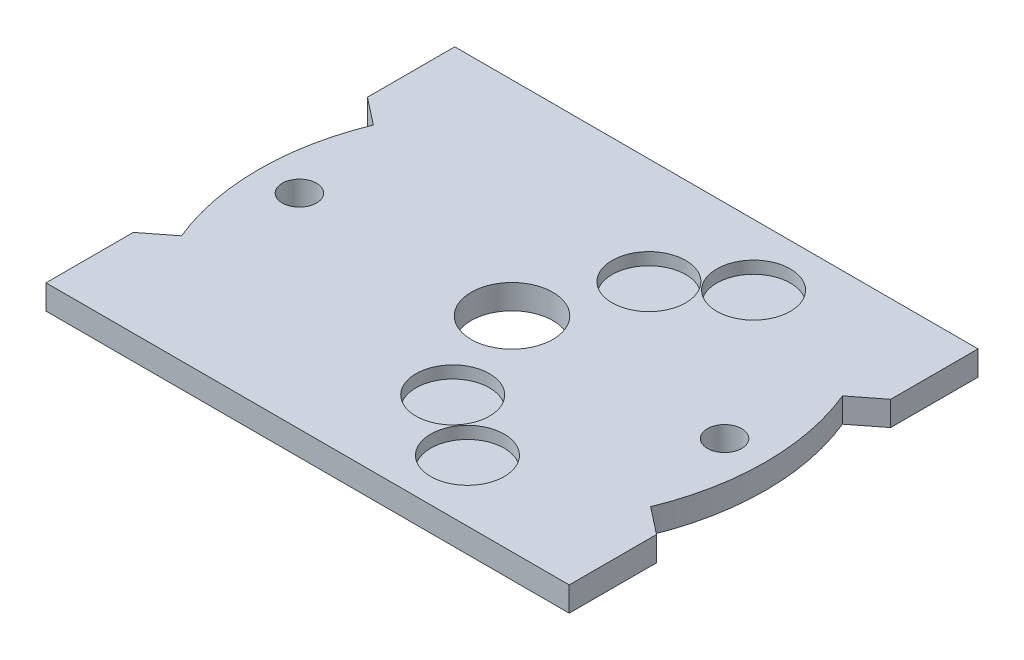
ISO-10303-21;
HEADER;
FILE_DESCRIPTION(('STEP AP214'),'2;1');
FILE_NAME('part.step','',(''),(''),'','','');
FILE_SCHEMA(('AUTOMOTIVE_DESIGN { 1 0 10303 214 1 1 1 1 }'));
ENDSEC;
DATA;
#1=APPLICATION_CONTEXT('core data for automotive mechanical design processes');
#2=APPLICATION_PROTOCOL_DEFINITION('international standard','automotive_design',2000,#1);
#3=PRODUCT_CONTEXT('',#1,'mechanical');
#4=PRODUCT('Part','Part','',(#3));
#5=PRODUCT_RELATED_PRODUCT_CATEGORY('part','',(#4));
#6=PRODUCT_DEFINITION_FORMATION('','',#4);
#7=PRODUCT_DEFINITION_CONTEXT('part definition',#1,'design');
#8=PRODUCT_DEFINITION('design','',#6,#7);
#9=PRODUCT_DEFINITION_SHAPE('','',#8);
#10=(LENGTH_UNIT() NAMED_UNIT(*) SI_UNIT(.MILLI.,.METRE.));
#11=(NAMED_UNIT(*) PLANE_ANGLE_UNIT() SI_UNIT($,.RADIAN.));
#12=(NAMED_UNIT(*) SI_UNIT($,.STERADIAN.) SOLID_ANGLE_UNIT());
#13=UNCERTAINTY_MEASURE_WITH_UNIT(LENGTH_MEASURE(1.E-05),#10,'distance_accuracy_value','');
#14=(GEOMETRIC_REPRESENTATION_CONTEXT(3) GLOBAL_UNCERTAINTY_ASSIGNED_CONTEXT((#13)) GLOBAL_UNIT_ASSIGNED_CONTEXT((#10,
#11,#12)) REPRESENTATION_CONTEXT('',''));
#15=CARTESIAN_POINT('',(0.,0.,0.));
#16=DIRECTION('',(0.,0.,1.));
#17=DIRECTION('',(1.,0.,0.));
#18=AXIS2_PLACEMENT_3D('',#15,#16,#17);
#19=CARTESIAN_POINT('',(0.,3.,0.));
#20=DIRECTION('',(0.,1.,0.));
#21=DIRECTION('',(0.,0.,1.));
#22=AXIS2_PLACEMENT_3D('',#19,#20,#21);
#23=PLANE('',#22);
#24=CARTESIAN_POINT('',(4.75,3.,-12.));
#25=DIRECTION('',(0.,1.,0.));
#26=DIRECTION('',(0.,0.,1.));
#27=AXIS2_PLACEMENT_3D('',#24,#25,#26);
#28=CIRCLE('',#27,4.5);
#29=CARTESIAN_POINT('',(4.75,3.,-7.49999999999999));
#30=VERTEX_POINT('',#29);
#31=EDGE_CURVE('E358',#30,#30,#28,.T.);
#32=ORIENTED_EDGE('',*,*,#31,.F.);
#33=EDGE_LOOP('',(#32));
#34=FACE_BOUND('',#33,.T.);
#35=CARTESIAN_POINT('',(12.05,3.,17.5));
#36=DIRECTION('',(0.,-1.,0.));
#37=DIRECTION('',(0.,0.,-1.));
#38=AXIS2_PLACEMENT_3D('',#35,#36,#37);
#39=CIRCLE('',#38,4.5);
#40=CARTESIAN_POINT('',(12.05,3.,13.));
#41=VERTEX_POINT('',#40);
#42=EDGE_CURVE('E361',#41,#41,#39,.T.);
#43=ORIENTED_EDGE('',*,*,#42,.T.);
#44=EDGE_LOOP('',(#43));
#45=FACE_BOUND('',#44,.T.);
#46=CARTESIAN_POINT('',(12.05,3.,-17.5));
#47=DIRECTION('',(0.,1.,0.));
#48=DIRECTION('',(0.,0.,1.));
#49=AXIS2_PLACEMENT_3D('',#46,#47,#48);
#50=CIRCLE('',#49,4.5);
#51=CARTESIAN_POINT('',(12.05,3.,-13.));
#52=VERTEX_POINT('',#51);
#53=EDGE_CURVE('E369',#52,#52,#50,.T.);
#54=ORIENTED_EDGE('',*,*,#53,.F.);
#55=EDGE_LOOP('',(#54));
#56=FACE_BOUND('',#55,.T.);
#57=CARTESIAN_POINT('',(0.,3.,0.));
#58=DIRECTION('',(0.,1.,0.));
#59=DIRECTION('',(0.,0.,1.));
#60=AXIS2_PLACEMENT_3D('',#57,#58,#59);
#61=CIRCLE('',#60,5.);
#62=CARTESIAN_POINT('',(0.,3.,5.));
#63=VERTEX_POINT('',#62);
#64=EDGE_CURVE('E92',#63,#63,#61,.F.);
#65=ORIENTED_EDGE('',*,*,#64,.T.);
#66=EDGE_LOOP('',(#65));
#67=FACE_BOUND('',#66,.T.);
#68=DIRECTION('',(-1.,0.,0.));
#69=VECTOR('',#68,1.);
#70=CARTESIAN_POINT('',(0.,3.,25.));
#71=LINE('',#70,#69);
#72=CARTESIAN_POINT('',(32.,3.,25.));
#73=VERTEX_POINT('',#72);
#74=CARTESIAN_POINT('',(-32.,3.,25.));
#75=VERTEX_POINT('',#74);
#76=EDGE_CURVE('E249',#73,#75,#71,.T.);
#77=ORIENTED_EDGE('',*,*,#76,.F.);
#78=DIRECTION('',(0.,0.,-1.));
#79=VECTOR('',#78,1.);
#80=CARTESIAN_POINT('',(32.,3.,0.));
#81=LINE('',#80,#79);
#82=CARTESIAN_POINT('',(32.,3.,14.320549046737));
#83=VERTEX_POINT('',#82);
#84=EDGE_CURVE('E375',#73,#83,#81,.T.);
#85=ORIENTED_EDGE('',*,*,#84,.T.);
#86=DIRECTION('',(0.788024373724563,0.,0.615644041972315));
#87=VECTOR('',#86,1.);
#88=CARTESIAN_POINT('',(5.18105564742899,3.,-6.63175122870911));
#89=LINE('',#88,#87);
#90=CARTESIAN_POINT('',(28.6924140746813,3.,11.7364975425818));
#91=VERTEX_POINT('',#90);
#92=EDGE_CURVE('E274',#91,#83,#89,.T.);
#93=ORIENTED_EDGE('',*,*,#92,.F.);
#94=CARTESIAN_POINT('',(0.,3.,0.));
#95=DIRECTION('',(0.,1.,0.));
#96=DIRECTION('',(0.,0.,1.));
#97=AXIS2_PLACEMENT_3D('',#94,#95,#96);
#98=CIRCLE('',#97,31.);
#99=CARTESIAN_POINT('',(28.6924140746813,3.,-11.7364975425818));
#100=VERTEX_POINT('',#99);
#101=EDGE_CURVE('E295',#91,#100,#98,.T.);
#102=ORIENTED_EDGE('',*,*,#101,.T.);
#103=DIRECTION('',(0.788024373724563,0.,-0.615644041972316));
#104=VECTOR('',#103,1.);
#105=CARTESIAN_POINT('',(5.18105564742899,3.,6.6317512287091));
#106=LINE('',#105,#104);
#107=CARTESIAN_POINT('',(32.,3.,-14.320549046737));
#108=VERTEX_POINT('',#107);
#109=EDGE_CURVE('E292',#100,#108,#106,.T.);
#110=ORIENTED_EDGE('',*,*,#109,.T.);
#111=DIRECTION('',(0.,0.,-1.));
#112=VECTOR('',#111,1.);
#113=CARTESIAN_POINT('',(32.,3.,0.));
#114=LINE('',#113,#112);
#115=CARTESIAN_POINT('',(32.,3.,-25.));
#116=VERTEX_POINT('',#115);
#117=EDGE_CURVE('E294',#108,#116,#114,.T.);
#118=ORIENTED_EDGE('',*,*,#117,.T.);
#119=DIRECTION('',(-1.,0.,0.));
#120=VECTOR('',#119,1.);
#121=CARTESIAN_POINT('',(0.,3.,-25.));
#122=LINE('',#121,#120);
#123=CARTESIAN_POINT('',(-32.,3.,-25.));
#124=VERTEX_POINT('',#123);
#125=EDGE_CURVE('E297',#116,#124,#122,.T.);
#126=ORIENTED_EDGE('',*,*,#125,.T.);
#127=DIRECTION('',(0.,0.,-1.));
#128=VECTOR('',#127,1.);
#129=CARTESIAN_POINT('',(-32.,3.,0.));
#130=LINE('',#129,#128);
#131=CARTESIAN_POINT('',(-32.,3.,-14.320549046737));
#132=VERTEX_POINT('',#131);
#133=EDGE_CURVE('E303',#132,#124,#130,.T.);
#134=ORIENTED_EDGE('',*,*,#133,.F.);
#135=DIRECTION('',(-0.788024373724563,0.,-0.615644041972316));
#136=VECTOR('',#135,1.);
#137=CARTESIAN_POINT('',(-5.181055647429,3.,6.63175122870911));
#138=LINE('',#137,#136);
#139=CARTESIAN_POINT('',(-28.6924140746813,3.,-11.7364975425818));
#140=VERTEX_POINT('',#139);
#141=EDGE_CURVE('E190',#140,#132,#138,.T.);
#142=ORIENTED_EDGE('',*,*,#141,.F.);
#143=CARTESIAN_POINT('',(0.,3.,0.));
#144=DIRECTION('',(0.,1.,0.));
#145=DIRECTION('',(0.,0.,1.));
#146=AXIS2_PLACEMENT_3D('',#143,#144,#145);
#147=CIRCLE('',#146,31.);
#148=CARTESIAN_POINT('',(-28.6924140746813,3.,11.7364975425818));
#149=VERTEX_POINT('',#148);
#150=EDGE_CURVE('E181',#140,#149,#147,.T.);
#151=ORIENTED_EDGE('',*,*,#150,.T.);
#152=DIRECTION('',(-0.788024373724563,0.,0.615644041972316));
#153=VECTOR('',#152,1.);
#154=CARTESIAN_POINT('',(-5.181055647429,3.,-6.63175122870911));
#155=LINE('',#154,#153);
#156=CARTESIAN_POINT('',(-32.,3.,14.320549046737));
#157=VERTEX_POINT('',#156);
#158=EDGE_CURVE('E187',#149,#157,#155,.T.);
#159=ORIENTED_EDGE('',*,*,#158,.T.);
#160=DIRECTION('',(0.,0.,-1.));
#161=VECTOR('',#160,1.);
#162=CARTESIAN_POINT('',(-32.,3.,0.));
#163=LINE('',#162,#161);
#164=EDGE_CURVE('E203',#75,#157,#163,.T.);
#165=ORIENTED_EDGE('',*,*,#164,.F.);
#166=EDGE_LOOP('',(#77,#85,#93,#102,#110,#118,#126,#134,#142,#151,#159,#165));
#167=FACE_BOUND('',#166,.T.);
#168=CARTESIAN_POINT('',(-26.,3.,0.));
#169=DIRECTION('',(0.,1.,0.));
#170=DIRECTION('',(0.,0.,1.));
#171=AXIS2_PLACEMENT_3D('',#168,#169,#170);
#172=CIRCLE('',#171,2.1);
#173=CARTESIAN_POINT('',(-26.,3.,2.10000000000001));
#174=VERTEX_POINT('',#173);
#175=EDGE_CURVE('E205',#174,#174,#172,.T.);
#176=ORIENTED_EDGE('',*,*,#175,.F.);
#177=EDGE_LOOP('',(#176));
#178=FACE_BOUND('',#177,.T.);
#179=CARTESIAN_POINT('',(26.,3.,0.));
#180=DIRECTION('',(0.,1.,0.));
#181=DIRECTION('',(0.,0.,1.));
#182=AXIS2_PLACEMENT_3D('',#179,#180,#181);
#183=CIRCLE('',#182,2.1);
#184=CARTESIAN_POINT('',(26.,3.,2.09999999999999));
#185=VERTEX_POINT('',#184);
#186=EDGE_CURVE('E211',#185,#185,#183,.F.);
#187=ORIENTED_EDGE('',*,*,#186,.T.);
#188=EDGE_LOOP('',(#187));
#189=FACE_BOUND('',#188,.T.);
#190=CARTESIAN_POINT('',(4.75,3.,12.));
#191=DIRECTION('',(0.,-1.,0.));
#192=DIRECTION('',(0.,0.,-1.));
#193=AXIS2_PLACEMENT_3D('',#190,#191,#192);
#194=CIRCLE('',#193,4.50000000000001);
#195=CARTESIAN_POINT('',(4.75,3.,7.49999999999998));
#196=VERTEX_POINT('',#195);
#197=EDGE_CURVE('E352',#196,#196,#194,.T.);
#198=ORIENTED_EDGE('',*,*,#197,.T.);
#199=EDGE_LOOP('',(#198));
#200=FACE_BOUND('',#199,.T.);
#201=ADVANCED_FACE('F88',(#34,#45,#56,#67,#167,#178,#189,#200),#23,.T.);
#202=CARTESIAN_POINT('',(26.,3.,0.));
#203=DIRECTION('',(0.,-1.,0.));
#204=DIRECTION('',(0.,0.,-1.));
#205=AXIS2_PLACEMENT_3D('',#202,#203,#204);
#206=CYLINDRICAL_SURFACE('',#205,2.1);
#207=ORIENTED_EDGE('',*,*,#186,.F.);
#208=EDGE_LOOP('',(#207));
#209=FACE_BOUND('',#208,.T.);
#210=CARTESIAN_POINT('',(26.,0.,0.));
#211=DIRECTION('',(0.,1.,0.));
#212=DIRECTION('',(0.,0.,1.));
#213=AXIS2_PLACEMENT_3D('',#210,#211,#212);
#214=CIRCLE('',#213,2.1);
#215=CARTESIAN_POINT('',(26.,0.,2.09999999999999));
#216=VERTEX_POINT('',#215);
#217=EDGE_CURVE('E246',#216,#216,#214,.F.);
#218=ORIENTED_EDGE('',*,*,#217,.T.);
#219=EDGE_LOOP('',(#218));
#220=FACE_BOUND('',#219,.T.);
#221=ADVANCED_FACE('F319',(#209,#220),#206,.F.);
#222=CARTESIAN_POINT('',(-26.,3.,0.));
#223=DIRECTION('',(0.,-1.,0.));
#224=DIRECTION('',(0.,0.,-1.));
#225=AXIS2_PLACEMENT_3D('',#222,#223,#224);
#226=CYLINDRICAL_SURFACE('',#225,2.1);
#227=ORIENTED_EDGE('',*,*,#175,.T.);
#228=EDGE_LOOP('',(#227));
#229=FACE_BOUND('',#228,.T.);
#230=CARTESIAN_POINT('',(-26.,0.,0.));
#231=DIRECTION('',(0.,1.,0.));
#232=DIRECTION('',(0.,0.,1.));
#233=AXIS2_PLACEMENT_3D('',#230,#231,#232);
#234=CIRCLE('',#233,2.1);
#235=CARTESIAN_POINT('',(-26.,0.,2.10000000000001));
#236=VERTEX_POINT('',#235);
#237=EDGE_CURVE('E243',#236,#236,#234,.T.);
#238=ORIENTED_EDGE('',*,*,#237,.F.);
#239=EDGE_LOOP('',(#238));
#240=FACE_BOUND('',#239,.T.);
#241=ADVANCED_FACE('F325',(#229,#240),#226,.F.);
#242=CARTESIAN_POINT('',(32.,3.,0.));
#243=DIRECTION('',(-1.,0.,0.));
#244=DIRECTION('',(0.,0.,1.));
#245=AXIS2_PLACEMENT_3D('',#242,#243,#244);
#246=PLANE('',#245);
#247=DIRECTION('',(0.,0.,-1.));
#248=VECTOR('',#247,1.);
#249=CARTESIAN_POINT('',(32.,0.,0.));
#250=LINE('',#249,#248);
#251=CARTESIAN_POINT('',(32.,0.,25.));
#252=VERTEX_POINT('',#251);
#253=CARTESIAN_POINT('',(32.,0.,14.320549046737));
#254=VERTEX_POINT('',#253);
#255=EDGE_CURVE('E216',#252,#254,#250,.T.);
#256=ORIENTED_EDGE('',*,*,#255,.T.);
#257=DIRECTION('',(0.,-1.,0.));
#258=VECTOR('',#257,1.);
#259=CARTESIAN_POINT('',(32.,3.,14.320549046737));
#260=LINE('',#259,#258);
#261=EDGE_CURVE('E98',#83,#254,#260,.T.);
#262=ORIENTED_EDGE('',*,*,#261,.F.);
#263=ORIENTED_EDGE('',*,*,#84,.F.);
#264=DIRECTION('',(0.,-1.,0.));
#265=VECTOR('',#264,1.);
#266=CARTESIAN_POINT('',(32.,3.,25.));
#267=LINE('',#266,#265);
#268=EDGE_CURVE('E12',#73,#252,#267,.T.);
#269=ORIENTED_EDGE('',*,*,#268,.T.);
#270=EDGE_LOOP('',(#256,#262,#263,#269));
#271=FACE_BOUND('',#270,.T.);
#272=ADVANCED_FACE('F277',(#271),#246,.F.);
#273=CARTESIAN_POINT('',(5.18105564742899,3.,-6.63175122870911));
#274=DIRECTION('',(0.615644041972315,0.,-0.788024373724563));
#275=DIRECTION('',(-0.788024373724563,0.,-0.615644041972315));
#276=AXIS2_PLACEMENT_3D('',#273,#274,#275);
#277=PLANE('',#276);
#278=DIRECTION('',(0.788024373724563,0.,0.615644041972315));
#279=VECTOR('',#278,1.);
#280=CARTESIAN_POINT('',(5.18105564742899,0.,-6.63175122870911));
#281=LINE('',#280,#279);
#282=CARTESIAN_POINT('',(28.6924140746813,0.,11.7364975425818));
#283=VERTEX_POINT('',#282);
#284=EDGE_CURVE('E219',#283,#254,#281,.T.);
#285=ORIENTED_EDGE('',*,*,#284,.F.);
#286=DIRECTION('',(0.,-1.,0.));
#287=VECTOR('',#286,1.);
#288=CARTESIAN_POINT('',(28.6924140746813,3.,11.7364975425818));
#289=LINE('',#288,#287);
#290=EDGE_CURVE('E266',#91,#283,#289,.T.);
#291=ORIENTED_EDGE('',*,*,#290,.F.);
#292=ORIENTED_EDGE('',*,*,#92,.T.);
#293=ORIENTED_EDGE('',*,*,#261,.T.);
#294=EDGE_LOOP('',(#285,#291,#292,#293));
#295=FACE_BOUND('',#294,.T.);
#296=ADVANCED_FACE('F272',(#295),#277,.T.);
#297=CARTESIAN_POINT('',(0.,3.,0.));
#298=DIRECTION('',(0.,-1.,0.));
#299=DIRECTION('',(0.,0.,-1.));
#300=AXIS2_PLACEMENT_3D('',#297,#298,#299);
#301=CYLINDRICAL_SURFACE('',#300,31.);
#302=CARTESIAN_POINT('',(0.,0.,0.));
#303=DIRECTION('',(0.,1.,0.));
#304=DIRECTION('',(0.,0.,1.));
#305=AXIS2_PLACEMENT_3D('',#302,#303,#304);
#306=CIRCLE('',#305,31.);
#307=CARTESIAN_POINT('',(28.6924140746813,0.,-11.7364975425818));
#308=VERTEX_POINT('',#307);
#309=EDGE_CURVE('E222',#283,#308,#306,.T.);
#310=ORIENTED_EDGE('',*,*,#309,.T.);
#311=DIRECTION('',(0.,-1.,0.));
#312=VECTOR('',#311,1.);
#313=CARTESIAN_POINT('',(28.6924140746813,3.,-11.7364975425818));
#314=LINE('',#313,#312);
#315=EDGE_CURVE('E263',#100,#308,#314,.T.);
#316=ORIENTED_EDGE('',*,*,#315,.F.);
#317=ORIENTED_EDGE('',*,*,#101,.F.);
#318=ORIENTED_EDGE('',*,*,#290,.T.);
#319=EDGE_LOOP('',(#310,#316,#317,#318));
#320=FACE_BOUND('',#319,.T.);
#321=ADVANCED_FACE('F286',(#320),#301,.T.);
#322=CARTESIAN_POINT('',(5.18105564742899,3.,6.6317512287091));
#323=DIRECTION('',(-0.615644041972315,0.,-0.788024373724563));
#324=DIRECTION('',(-0.788024373724563,0.,0.615644041972316));
#325=AXIS2_PLACEMENT_3D('',#322,#323,#324);
#326=PLANE('',#325);
#327=DIRECTION('',(0.788024373724563,0.,-0.615644041972316));
#328=VECTOR('',#327,1.);
#329=CARTESIAN_POINT('',(5.18105564742899,0.,6.6317512287091));
#330=LINE('',#329,#328);
#331=CARTESIAN_POINT('',(32.,0.,-14.320549046737));
#332=VERTEX_POINT('',#331);
#333=EDGE_CURVE('E224',#308,#332,#330,.T.);
#334=ORIENTED_EDGE('',*,*,#333,.T.);
#335=DIRECTION('',(0.,-1.,0.));
#336=VECTOR('',#335,1.);
#337=CARTESIAN_POINT('',(32.,3.,-14.320549046737));
#338=LINE('',#337,#336);
#339=EDGE_CURVE('E260',#108,#332,#338,.T.);
#340=ORIENTED_EDGE('',*,*,#339,.F.);
#341=ORIENTED_EDGE('',*,*,#109,.F.);
#342=ORIENTED_EDGE('',*,*,#315,.T.);
#343=EDGE_LOOP('',(#334,#340,#341,#342));
#344=FACE_BOUND('',#343,.T.);
#345=ADVANCED_FACE('F290',(#344),#326,.F.);
#346=CARTESIAN_POINT('',(32.,3.,0.));
#347=DIRECTION('',(-1.,0.,0.));
#348=DIRECTION('',(0.,0.,1.));
#349=AXIS2_PLACEMENT_3D('',#346,#347,#348);
#350=PLANE('',#349);
#351=DIRECTION('',(0.,0.,-1.));
#352=VECTOR('',#351,1.);
#353=CARTESIAN_POINT('',(32.,0.,0.));
#354=LINE('',#353,#352);
#355=CARTESIAN_POINT('',(32.,0.,-25.));
#356=VERTEX_POINT('',#355);
#357=EDGE_CURVE('E226',#332,#356,#354,.T.);
#358=ORIENTED_EDGE('',*,*,#357,.T.);
#359=DIRECTION('',(0.,-1.,0.));
#360=VECTOR('',#359,1.);
#361=CARTESIAN_POINT('',(32.,3.,-25.));
#362=LINE('',#361,#360);
#363=EDGE_CURVE('E257',#116,#356,#362,.T.);
#364=ORIENTED_EDGE('',*,*,#363,.F.);
#365=ORIENTED_EDGE('',*,*,#117,.F.);
#366=ORIENTED_EDGE('',*,*,#339,.T.);
#367=EDGE_LOOP('',(#358,#364,#365,#366));
#368=FACE_BOUND('',#367,.T.);
#369=ADVANCED_FACE('F547',(#368),#350,.F.);
#370=CARTESIAN_POINT('',(0.,3.,-25.));
#371=DIRECTION('',(0.,0.,1.));
#372=DIRECTION('',(1.,0.,0.));
#373=AXIS2_PLACEMENT_3D('',#370,#371,#372);
#374=PLANE('',#373);
#375=DIRECTION('',(-1.,0.,0.));
#376=VECTOR('',#375,1.);
#377=CARTESIAN_POINT('',(0.,0.,-25.));
#378=LINE('',#377,#376);
#379=CARTESIAN_POINT('',(-32.,0.,-25.));
#380=VERTEX_POINT('',#379);
#381=EDGE_CURVE('E228',#356,#380,#378,.T.);
#382=ORIENTED_EDGE('',*,*,#381,.T.);
#383=DIRECTION('',(0.,-1.,0.));
#384=VECTOR('',#383,1.);
#385=CARTESIAN_POINT('',(-32.,3.,-25.));
#386=LINE('',#385,#384);
#387=EDGE_CURVE('E255',#124,#380,#386,.T.);
#388=ORIENTED_EDGE('',*,*,#387,.F.);
#389=ORIENTED_EDGE('',*,*,#125,.F.);
#390=ORIENTED_EDGE('',*,*,#363,.T.);
#391=EDGE_LOOP('',(#382,#388,#389,#390));
#392=FACE_BOUND('',#391,.T.);
#393=ADVANCED_FACE('F537',(#392),#374,.F.);
#394=CARTESIAN_POINT('',(-32.,3.,0.));
#395=DIRECTION('',(-1.,0.,0.));
#396=DIRECTION('',(0.,0.,1.));
#397=AXIS2_PLACEMENT_3D('',#394,#395,#396);
#398=PLANE('',#397);
#399=DIRECTION('',(0.,0.,-1.));
#400=VECTOR('',#399,1.);
#401=CARTESIAN_POINT('',(-32.,0.,0.));
#402=LINE('',#401,#400);
#403=CARTESIAN_POINT('',(-32.,0.,-14.320549046737));
#404=VERTEX_POINT('',#403);
#405=EDGE_CURVE('E231',#404,#380,#402,.T.);
#406=ORIENTED_EDGE('',*,*,#405,.F.);
#407=DIRECTION('',(0.,-1.,0.));
#408=VECTOR('',#407,1.);
#409=CARTESIAN_POINT('',(-32.,3.,-14.320549046737));
#410=LINE('',#409,#408);
#411=EDGE_CURVE('E253',#132,#404,#410,.T.);
#412=ORIENTED_EDGE('',*,*,#411,.F.);
#413=ORIENTED_EDGE('',*,*,#133,.T.);
#414=ORIENTED_EDGE('',*,*,#387,.T.);
#415=EDGE_LOOP('',(#406,#412,#413,#414));
#416=FACE_BOUND('',#415,.T.);
#417=ADVANCED_FACE('F528',(#416),#398,.T.);
#418=CARTESIAN_POINT('',(-5.181055647429,3.,6.63175122870911));
#419=DIRECTION('',(-0.615644041972315,0.,0.788024373724563));
#420=DIRECTION('',(0.788024373724563,0.,0.615644041972316));
#421=AXIS2_PLACEMENT_3D('',#418,#419,#420);
#422=PLANE('',#421);
#423=DIRECTION('',(-0.788024373724563,0.,-0.615644041972316));
#424=VECTOR('',#423,1.);
#425=CARTESIAN_POINT('',(-5.181055647429,0.,6.63175122870911));
#426=LINE('',#425,#424);
#427=CARTESIAN_POINT('',(-28.6924140746813,0.,-11.7364975425818));
#428=VERTEX_POINT('',#427);
#429=EDGE_CURVE('E234',#428,#404,#426,.T.);
#430=ORIENTED_EDGE('',*,*,#429,.F.);
#431=DIRECTION('',(0.,-1.,0.));
#432=VECTOR('',#431,1.);
#433=CARTESIAN_POINT('',(-28.6924140746813,3.,-11.7364975425818));
#434=LINE('',#433,#432);
#435=EDGE_CURVE('E200',#140,#428,#434,.T.);
#436=ORIENTED_EDGE('',*,*,#435,.F.);
#437=ORIENTED_EDGE('',*,*,#141,.T.);
#438=ORIENTED_EDGE('',*,*,#411,.T.);
#439=EDGE_LOOP('',(#430,#436,#437,#438));
#440=FACE_BOUND('',#439,.T.);
#441=ADVANCED_FACE('F307',(#440),#422,.T.);
#442=CARTESIAN_POINT('',(0.,3.,0.));
#443=DIRECTION('',(0.,-1.,0.));
#444=DIRECTION('',(0.,0.,-1.));
#445=AXIS2_PLACEMENT_3D('',#442,#443,#444);
#446=CYLINDRICAL_SURFACE('',#445,31.);
#447=CARTESIAN_POINT('',(0.,0.,0.));
#448=DIRECTION('',(0.,1.,0.));
#449=DIRECTION('',(0.,0.,1.));
#450=AXIS2_PLACEMENT_3D('',#447,#448,#449);
#451=CIRCLE('',#450,31.);
#452=CARTESIAN_POINT('',(-28.6924140746813,0.,11.7364975425818));
#453=VERTEX_POINT('',#452);
#454=EDGE_CURVE('E197',#428,#453,#451,.T.);
#455=ORIENTED_EDGE('',*,*,#454,.T.);
#456=DIRECTION('',(0.,-1.,0.));
#457=VECTOR('',#456,1.);
#458=CARTESIAN_POINT('',(-28.6924140746813,3.,11.7364975425818));
#459=LINE('',#458,#457);
#460=EDGE_CURVE('E194',#149,#453,#459,.T.);
#461=ORIENTED_EDGE('',*,*,#460,.F.);
#462=ORIENTED_EDGE('',*,*,#150,.F.);
#463=ORIENTED_EDGE('',*,*,#435,.T.);
#464=EDGE_LOOP('',(#455,#461,#462,#463));
#465=FACE_BOUND('',#464,.T.);
#466=ADVANCED_FACE('F195',(#465),#446,.T.);
#467=CARTESIAN_POINT('',(-5.181055647429,3.,-6.63175122870911));
#468=DIRECTION('',(0.615644041972316,0.,0.788024373724563));
#469=DIRECTION('',(0.788024373724563,0.,-0.615644041972316));
#470=AXIS2_PLACEMENT_3D('',#467,#468,#469);
#471=PLANE('',#470);
#472=DIRECTION('',(-0.788024373724563,0.,0.615644041972316));
#473=VECTOR('',#472,1.);
#474=CARTESIAN_POINT('',(-5.181055647429,0.,-6.63175122870911));
#475=LINE('',#474,#473);
#476=CARTESIAN_POINT('',(-32.,0.,14.320549046737));
#477=VERTEX_POINT('',#476);
#478=EDGE_CURVE('E238',#453,#477,#475,.T.);
#479=ORIENTED_EDGE('',*,*,#478,.T.);
#480=DIRECTION('',(0.,-1.,0.));
#481=VECTOR('',#480,1.);
#482=CARTESIAN_POINT('',(-32.,3.,14.320549046737));
#483=LINE('',#482,#481);
#484=EDGE_CURVE('E144',#157,#477,#483,.T.);
#485=ORIENTED_EDGE('',*,*,#484,.F.);
#486=ORIENTED_EDGE('',*,*,#158,.F.);
#487=ORIENTED_EDGE('',*,*,#460,.T.);
#488=EDGE_LOOP('',(#479,#485,#486,#487));
#489=FACE_BOUND('',#488,.T.);
#490=ADVANCED_FACE('F202',(#489),#471,.F.);
#491=CARTESIAN_POINT('',(-32.,3.,0.));
#492=DIRECTION('',(-1.,0.,0.));
#493=DIRECTION('',(0.,0.,1.));
#494=AXIS2_PLACEMENT_3D('',#491,#492,#493);
#495=PLANE('',#494);
#496=DIRECTION('',(0.,0.,-1.));
#497=VECTOR('',#496,1.);
#498=CARTESIAN_POINT('',(-32.,0.,0.));
#499=LINE('',#498,#497);
#500=CARTESIAN_POINT('',(-32.,0.,25.));
#501=VERTEX_POINT('',#500);
#502=EDGE_CURVE('E240',#501,#477,#499,.T.);
#503=ORIENTED_EDGE('',*,*,#502,.F.);
#504=DIRECTION('',(0.,-1.,0.));
#505=VECTOR('',#504,1.);
#506=CARTESIAN_POINT('',(-32.,3.,25.));
#507=LINE('',#506,#505);
#508=EDGE_CURVE('E106',#75,#501,#507,.T.);
#509=ORIENTED_EDGE('',*,*,#508,.F.);
#510=ORIENTED_EDGE('',*,*,#164,.T.);
#511=ORIENTED_EDGE('',*,*,#484,.T.);
#512=EDGE_LOOP('',(#503,#509,#510,#511));
#513=FACE_BOUND('',#512,.T.);
#514=ADVANCED_FACE('F309',(#513),#495,.T.);
#515=CARTESIAN_POINT('',(0.,3.,25.));
#516=DIRECTION('',(0.,0.,1.));
#517=DIRECTION('',(1.,0.,0.));
#518=AXIS2_PLACEMENT_3D('',#515,#516,#517);
#519=PLANE('',#518);
#520=DIRECTION('',(-1.,0.,0.));
#521=VECTOR('',#520,1.);
#522=CARTESIAN_POINT('',(0.,0.,25.));
#523=LINE('',#522,#521);
#524=EDGE_CURVE('E214',#252,#501,#523,.T.);
#525=ORIENTED_EDGE('',*,*,#524,.F.);
#526=ORIENTED_EDGE('',*,*,#268,.F.);
#527=ORIENTED_EDGE('',*,*,#76,.T.);
#528=ORIENTED_EDGE('',*,*,#508,.T.);
#529=EDGE_LOOP('',(#525,#526,#527,#528));
#530=FACE_BOUND('',#529,.T.);
#531=ADVANCED_FACE('F90',(#530),#519,.T.);
#532=CARTESIAN_POINT('',(0.,0.,0.));
#533=DIRECTION('',(0.,1.,0.));
#534=DIRECTION('',(0.,0.,1.));
#535=AXIS2_PLACEMENT_3D('',#532,#533,#534);
#536=PLANE('',#535);
#537=CARTESIAN_POINT('',(0.,0.,0.));
#538=DIRECTION('',(0.,1.,0.));
#539=DIRECTION('',(0.,0.,1.));
#540=AXIS2_PLACEMENT_3D('',#537,#538,#539);
#541=CIRCLE('',#540,5.);
#542=CARTESIAN_POINT('',(0.,0.,5.));
#543=VERTEX_POINT('',#542);
#544=EDGE_CURVE('E368',#543,#543,#541,.T.);
#545=ORIENTED_EDGE('',*,*,#544,.T.);
#546=EDGE_LOOP('',(#545));
#547=FACE_BOUND('',#546,.T.);
#548=ORIENTED_EDGE('',*,*,#524,.T.);
#549=ORIENTED_EDGE('',*,*,#502,.T.);
#550=ORIENTED_EDGE('',*,*,#478,.F.);
#551=ORIENTED_EDGE('',*,*,#454,.F.);
#552=ORIENTED_EDGE('',*,*,#429,.T.);
#553=ORIENTED_EDGE('',*,*,#405,.T.);
#554=ORIENTED_EDGE('',*,*,#381,.F.);
#555=ORIENTED_EDGE('',*,*,#357,.F.);
#556=ORIENTED_EDGE('',*,*,#333,.F.);
#557=ORIENTED_EDGE('',*,*,#309,.F.);
#558=ORIENTED_EDGE('',*,*,#284,.T.);
#559=ORIENTED_EDGE('',*,*,#255,.F.);
#560=EDGE_LOOP('',(#548,#549,#550,#551,#552,#553,#554,#555,#556,#557,#558,#559));
#561=FACE_BOUND('',#560,.T.);
#562=ORIENTED_EDGE('',*,*,#237,.T.);
#563=EDGE_LOOP('',(#562));
#564=FACE_BOUND('',#563,.T.);
#565=ORIENTED_EDGE('',*,*,#217,.F.);
#566=EDGE_LOOP('',(#565));
#567=FACE_BOUND('',#566,.T.);
#568=ADVANCED_FACE('F280',(#547,#561,#564,#567),#536,.F.);
#569=CARTESIAN_POINT('',(0.,10.,0.));
#570=DIRECTION('',(0.,-1.,0.));
#571=DIRECTION('',(0.,0.,-1.));
#572=AXIS2_PLACEMENT_3D('',#569,#570,#571);
#573=CYLINDRICAL_SURFACE('',#572,5.);
#574=ORIENTED_EDGE('',*,*,#64,.F.);
#575=EDGE_LOOP('',(#574));
#576=FACE_BOUND('',#575,.T.);
#577=ORIENTED_EDGE('',*,*,#544,.F.);
#578=EDGE_LOOP('',(#577));
#579=FACE_BOUND('',#578,.T.);
#580=ADVANCED_FACE('F332',(#576,#579),#573,.F.);
#581=CARTESIAN_POINT('',(12.05,1.5,-17.5));
#582=DIRECTION('',(0.,1.,0.));
#583=DIRECTION('',(0.,0.,1.));
#584=AXIS2_PLACEMENT_3D('',#581,#582,#583);
#585=CYLINDRICAL_SURFACE('',#584,4.5);
#586=CARTESIAN_POINT('',(12.05,1.5,-17.5));
#587=DIRECTION('',(0.,1.,0.));
#588=DIRECTION('',(0.,0.,1.));
#589=AXIS2_PLACEMENT_3D('',#586,#587,#588);
#590=CIRCLE('',#589,4.5);
#591=CARTESIAN_POINT('',(12.05,1.5,-13.));
#592=VERTEX_POINT('',#591);
#593=EDGE_CURVE('E365',#592,#592,#590,.T.);
#594=ORIENTED_EDGE('',*,*,#593,.F.);
#595=EDGE_LOOP('',(#594));
#596=FACE_BOUND('',#595,.T.);
#597=ORIENTED_EDGE('',*,*,#53,.T.);
#598=EDGE_LOOP('',(#597));
#599=FACE_BOUND('',#598,.T.);
#600=ADVANCED_FACE('F383',(#596,#599),#585,.F.);
#601=CARTESIAN_POINT('',(12.05,1.5,-17.5));
#602=DIRECTION('',(0.,1.,0.));
#603=DIRECTION('',(0.,0.,1.));
#604=AXIS2_PLACEMENT_3D('',#601,#602,#603);
#605=PLANE('',#604);
#606=ORIENTED_EDGE('',*,*,#593,.T.);
#607=EDGE_LOOP('',(#606));
#608=FACE_BOUND('',#607,.T.);
#609=ADVANCED_FACE('F387',(#608),#605,.T.);
#610=CARTESIAN_POINT('',(12.05,1.5,17.5));
#611=DIRECTION('',(0.,1.,0.));
#612=DIRECTION('',(0.,0.,1.));
#613=AXIS2_PLACEMENT_3D('',#610,#611,#612);
#614=CYLINDRICAL_SURFACE('',#613,4.5);
#615=CARTESIAN_POINT('',(12.05,1.5,17.5));
#616=DIRECTION('',(0.,-1.,0.));
#617=DIRECTION('',(0.,0.,-1.));
#618=AXIS2_PLACEMENT_3D('',#615,#616,#617);
#619=CIRCLE('',#618,4.5);
#620=CARTESIAN_POINT('',(12.05,1.5,13.));
#621=VERTEX_POINT('',#620);
#622=EDGE_CURVE('E425',#621,#621,#619,.T.);
#623=ORIENTED_EDGE('',*,*,#622,.T.);
#624=EDGE_LOOP('',(#623));
#625=FACE_BOUND('',#624,.T.);
#626=ORIENTED_EDGE('',*,*,#42,.F.);
#627=EDGE_LOOP('',(#626));
#628=FACE_BOUND('',#627,.T.);
#629=ADVANCED_FACE('F392',(#625,#628),#614,.F.);
#630=CARTESIAN_POINT('',(12.05,1.5,17.5));
#631=DIRECTION('',(0.,-1.,0.));
#632=DIRECTION('',(0.,0.,-1.));
#633=AXIS2_PLACEMENT_3D('',#630,#631,#632);
#634=PLANE('',#633);
#635=ORIENTED_EDGE('',*,*,#622,.F.);
#636=EDGE_LOOP('',(#635));
#637=FACE_BOUND('',#636,.T.);
#638=ADVANCED_FACE('F406',(#637),#634,.F.);
#639=CARTESIAN_POINT('',(4.75,1.5,12.));
#640=DIRECTION('',(0.,1.,0.));
#641=DIRECTION('',(0.,0.,1.));
#642=AXIS2_PLACEMENT_3D('',#639,#640,#641);
#643=CYLINDRICAL_SURFACE('',#642,4.50000000000001);
#644=CARTESIAN_POINT('',(4.75,1.5,12.));
#645=DIRECTION('',(0.,-1.,0.));
#646=DIRECTION('',(0.,0.,-1.));
#647=AXIS2_PLACEMENT_3D('',#644,#645,#646);
#648=CIRCLE('',#647,4.50000000000001);
#649=CARTESIAN_POINT('',(4.75,1.5,7.49999999999998));
#650=VERTEX_POINT('',#649);
#651=EDGE_CURVE('E355',#650,#650,#648,.T.);
#652=ORIENTED_EDGE('',*,*,#651,.T.);
#653=EDGE_LOOP('',(#652));
#654=FACE_BOUND('',#653,.T.);
#655=ORIENTED_EDGE('',*,*,#197,.F.);
#656=EDGE_LOOP('',(#655));
#657=FACE_BOUND('',#656,.T.);
#658=ADVANCED_FACE('F402',(#654,#657),#643,.F.);
#659=CARTESIAN_POINT('',(4.75,1.5,12.));
#660=DIRECTION('',(0.,-1.,0.));
#661=DIRECTION('',(0.,0.,-1.));
#662=AXIS2_PLACEMENT_3D('',#659,#660,#661);
#663=PLANE('',#662);
#664=ORIENTED_EDGE('',*,*,#651,.F.);
#665=EDGE_LOOP('',(#664));
#666=FACE_BOUND('',#665,.T.);
#667=ADVANCED_FACE('F398',(#666),#663,.F.);
#668=CARTESIAN_POINT('',(4.75,1.5,-12.));
#669=DIRECTION('',(0.,1.,0.));
#670=DIRECTION('',(0.,0.,1.));
#671=AXIS2_PLACEMENT_3D('',#668,#669,#670);
#672=CYLINDRICAL_SURFACE('',#671,4.5);
#673=CARTESIAN_POINT('',(4.75,1.5,-12.));
#674=DIRECTION('',(0.,1.,0.));
#675=DIRECTION('',(0.,0.,1.));
#676=AXIS2_PLACEMENT_3D('',#673,#674,#675);
#677=CIRCLE('',#676,4.5);
#678=CARTESIAN_POINT('',(4.75,1.5,-7.49999999999999));
#679=VERTEX_POINT('',#678);
#680=EDGE_CURVE('E354',#679,#679,#677,.T.);
#681=ORIENTED_EDGE('',*,*,#680,.F.);
#682=EDGE_LOOP('',(#681));
#683=FACE_BOUND('',#682,.T.);
#684=ORIENTED_EDGE('',*,*,#31,.T.);
#685=EDGE_LOOP('',(#684));
#686=FACE_BOUND('',#685,.T.);
#687=ADVANCED_FACE('F401',(#683,#686),#672,.F.);
#688=CARTESIAN_POINT('',(4.75,1.5,-12.));
#689=DIRECTION('',(0.,1.,0.));
#690=DIRECTION('',(0.,0.,1.));
#691=AXIS2_PLACEMENT_3D('',#688,#689,#690);
#692=PLANE('',#691);
#693=ORIENTED_EDGE('',*,*,#680,.T.);
#694=EDGE_LOOP('',(#693));
#695=FACE_BOUND('',#694,.T.);
#696=ADVANCED_FACE('F408',(#695),#692,.T.);
#697=CLOSED_SHELL('',(#201,#221,#241,#272,#296,#321,#345,#369,#393,#417,#441,#466,#490,#514,
#531,#568,#580,#600,#609,#629,#638,#658,#667,#687,#696));
#698=MANIFOLD_SOLID_BREP('B2',#697);
#699=ADVANCED_BREP_SHAPE_REPRESENTATION('',(#18,#698),#14);
#700=SHAPE_DEFINITION_REPRESENTATION(#9,#699);
ENDSEC;
END-ISO-10303-21;
